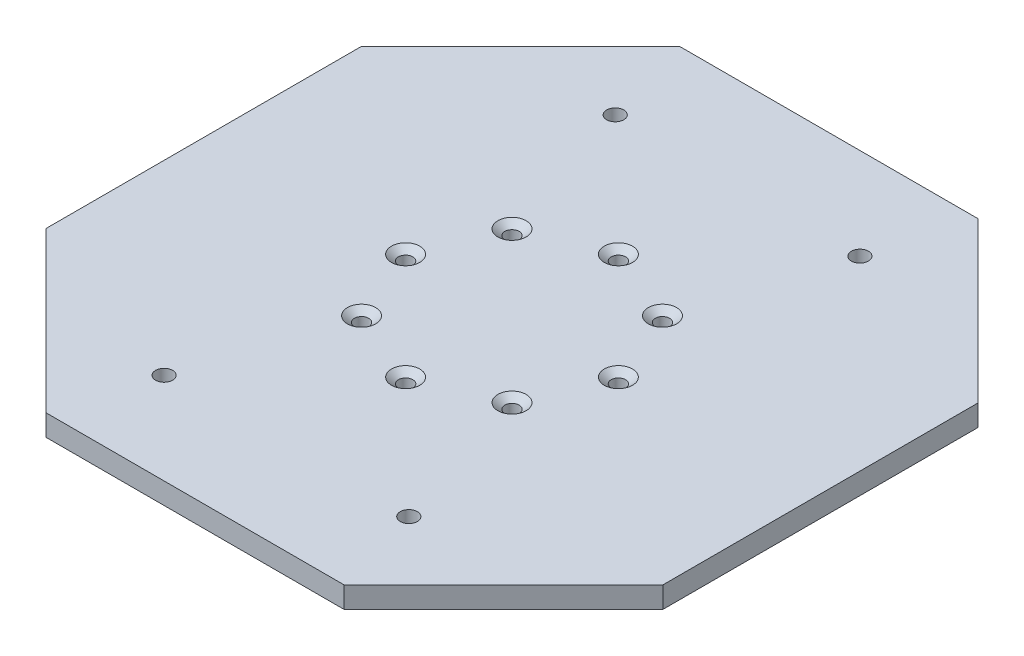
ISO-10303-21;
HEADER;
FILE_DESCRIPTION(('STEP AP214'),'2;1');
FILE_NAME('part.step','',(''),(''),'','','');
FILE_SCHEMA(('AUTOMOTIVE_DESIGN { 1 0 10303 214 1 1 1 1 }'));
ENDSEC;
DATA;
#1=APPLICATION_CONTEXT('core data for automotive mechanical design processes');
#2=APPLICATION_PROTOCOL_DEFINITION('international standard','automotive_design',2000,#1);
#3=PRODUCT_CONTEXT('',#1,'mechanical');
#4=PRODUCT('Part','Part','',(#3));
#5=PRODUCT_RELATED_PRODUCT_CATEGORY('part','',(#4));
#6=PRODUCT_DEFINITION_FORMATION('','',#4);
#7=PRODUCT_DEFINITION_CONTEXT('part definition',#1,'design');
#8=PRODUCT_DEFINITION('design','',#6,#7);
#9=PRODUCT_DEFINITION_SHAPE('','',#8);
#10=(LENGTH_UNIT() NAMED_UNIT(*) SI_UNIT(.MILLI.,.METRE.));
#11=(NAMED_UNIT(*) PLANE_ANGLE_UNIT() SI_UNIT($,.RADIAN.));
#12=(NAMED_UNIT(*) SI_UNIT($,.STERADIAN.) SOLID_ANGLE_UNIT());
#13=UNCERTAINTY_MEASURE_WITH_UNIT(LENGTH_MEASURE(1.E-05),#10,'distance_accuracy_value','');
#14=(GEOMETRIC_REPRESENTATION_CONTEXT(3) GLOBAL_UNCERTAINTY_ASSIGNED_CONTEXT((#13)) GLOBAL_UNIT_ASSIGNED_CONTEXT((#10,
#11,#12)) REPRESENTATION_CONTEXT('',''));
#15=CARTESIAN_POINT('',(0.,0.,0.));
#16=DIRECTION('',(0.,0.,1.));
#17=DIRECTION('',(1.,0.,0.));
#18=AXIS2_PLACEMENT_3D('',#15,#16,#17);
#19=CARTESIAN_POINT('',(-92.075,0.,-94.615));
#20=DIRECTION('',(0.,-1.,0.));
#21=DIRECTION('',(0.,0.,-1.));
#22=AXIS2_PLACEMENT_3D('',#19,#20,#21);
#23=PLANE('',#22);
#24=CARTESIAN_POINT('',(-22.4506403026726,0.,22.4506403026732));
#25=DIRECTION('',(0.,1.,0.));
#26=DIRECTION('',(0.,0.,1.));
#27=AXIS2_PLACEMENT_3D('',#24,#25,#26);
#28=CIRCLE('',#27,2.15264999999999);
#29=CARTESIAN_POINT('',(-22.4506403026726,0.,24.6032903026731));
#30=VERTEX_POINT('',#29);
#31=EDGE_CURVE('E264',#30,#30,#28,.T.);
#32=ORIENTED_EDGE('',*,*,#31,.T.);
#33=EDGE_LOOP('',(#32));
#34=FACE_BOUND('',#33,.T.);
#35=CARTESIAN_POINT('',(-31.75,0.,3.32563597524808E-13));
#36=DIRECTION('',(0.,1.,0.));
#37=DIRECTION('',(0.,0.,1.));
#38=AXIS2_PLACEMENT_3D('',#35,#36,#37);
#39=CIRCLE('',#38,2.15264999999999);
#40=CARTESIAN_POINT('',(-31.75,0.,2.15265000000032));
#41=VERTEX_POINT('',#40);
#42=EDGE_CURVE('E255',#41,#41,#39,.T.);
#43=ORIENTED_EDGE('',*,*,#42,.T.);
#44=EDGE_LOOP('',(#43));
#45=FACE_BOUND('',#44,.T.);
#46=CARTESIAN_POINT('',(-22.4506403026731,0.,-22.4506403026727));
#47=DIRECTION('',(0.,1.,0.));
#48=DIRECTION('',(0.,0.,1.));
#49=AXIS2_PLACEMENT_3D('',#46,#47,#48);
#50=CIRCLE('',#49,2.15264999999999);
#51=CARTESIAN_POINT('',(-22.4506403026731,0.,-20.2979903026727));
#52=VERTEX_POINT('',#51);
#53=EDGE_CURVE('E246',#52,#52,#50,.T.);
#54=ORIENTED_EDGE('',*,*,#53,.T.);
#55=EDGE_LOOP('',(#54));
#56=FACE_BOUND('',#55,.T.);
#57=CARTESIAN_POINT('',(0.,0.,-31.75));
#58=DIRECTION('',(0.,1.,0.));
#59=DIRECTION('',(0.,0.,1.));
#60=AXIS2_PLACEMENT_3D('',#57,#58,#59);
#61=CIRCLE('',#60,2.15264999999999);
#62=CARTESIAN_POINT('',(0.,0.,-29.59735));
#63=VERTEX_POINT('',#62);
#64=EDGE_CURVE('E237',#63,#63,#61,.T.);
#65=ORIENTED_EDGE('',*,*,#64,.T.);
#66=EDGE_LOOP('',(#65));
#67=FACE_BOUND('',#66,.T.);
#68=CARTESIAN_POINT('',(22.4506403026728,0.,-22.450640302673));
#69=DIRECTION('',(0.,1.,0.));
#70=DIRECTION('',(0.,0.,1.));
#71=AXIS2_PLACEMENT_3D('',#68,#69,#70);
#72=CIRCLE('',#71,2.15264999999999);
#73=CARTESIAN_POINT('',(22.4506403026728,0.,-20.297990302673));
#74=VERTEX_POINT('',#73);
#75=EDGE_CURVE('E228',#74,#74,#72,.T.);
#76=ORIENTED_EDGE('',*,*,#75,.T.);
#77=EDGE_LOOP('',(#76));
#78=FACE_BOUND('',#77,.T.);
#79=CARTESIAN_POINT('',(31.75,0.,-1.10854532508269E-13));
#80=DIRECTION('',(0.,1.,0.));
#81=DIRECTION('',(0.,0.,1.));
#82=AXIS2_PLACEMENT_3D('',#79,#80,#81);
#83=CIRCLE('',#82,2.15264999999999);
#84=CARTESIAN_POINT('',(31.75,0.,2.15264999999987));
#85=VERTEX_POINT('',#84);
#86=EDGE_CURVE('E219',#85,#85,#83,.T.);
#87=ORIENTED_EDGE('',*,*,#86,.T.);
#88=EDGE_LOOP('',(#87));
#89=FACE_BOUND('',#88,.T.);
#90=CARTESIAN_POINT('',(22.4506403026729,0.,22.4506403026728));
#91=DIRECTION('',(0.,1.,0.));
#92=DIRECTION('',(0.,0.,1.));
#93=AXIS2_PLACEMENT_3D('',#90,#91,#92);
#94=CIRCLE('',#93,2.15264999999999);
#95=CARTESIAN_POINT('',(22.4506403026729,0.,24.6032903026728));
#96=VERTEX_POINT('',#95);
#97=EDGE_CURVE('E210',#96,#96,#94,.T.);
#98=ORIENTED_EDGE('',*,*,#97,.T.);
#99=EDGE_LOOP('',(#98));
#100=FACE_BOUND('',#99,.T.);
#101=CARTESIAN_POINT('',(0.,0.,31.75));
#102=DIRECTION('',(0.,1.,0.));
#103=DIRECTION('',(0.,0.,1.));
#104=AXIS2_PLACEMENT_3D('',#101,#102,#103);
#105=CIRCLE('',#104,2.15264999999999);
#106=CARTESIAN_POINT('',(0.,0.,33.90265));
#107=VERTEX_POINT('',#106);
#108=EDGE_CURVE('E201',#107,#107,#105,.T.);
#109=ORIENTED_EDGE('',*,*,#108,.T.);
#110=EDGE_LOOP('',(#109));
#111=FACE_BOUND('',#110,.T.);
#112=CARTESIAN_POINT('',(36.5125,0.,67.31));
#113=DIRECTION('',(0.,1.,0.));
#114=DIRECTION('',(0.,0.,1.));
#115=AXIS2_PLACEMENT_3D('',#112,#113,#114);
#116=CIRCLE('',#115,2.5527);
#117=CARTESIAN_POINT('',(36.5125,0.,69.8627));
#118=VERTEX_POINT('',#117);
#119=EDGE_CURVE('E195',#118,#118,#116,.T.);
#120=ORIENTED_EDGE('',*,*,#119,.T.);
#121=EDGE_LOOP('',(#120));
#122=FACE_BOUND('',#121,.T.);
#123=DIRECTION('',(0.,0.,1.));
#124=VECTOR('',#123,1.);
#125=CARTESIAN_POINT('',(-92.075,0.,46.99));
#126=LINE('',#125,#124);
#127=CARTESIAN_POINT('',(-92.075,0.,-46.99));
#128=VERTEX_POINT('',#127);
#129=CARTESIAN_POINT('',(-92.075,0.,46.99));
#130=VERTEX_POINT('',#129);
#131=EDGE_CURVE('E130',#128,#130,#126,.T.);
#132=ORIENTED_EDGE('',*,*,#131,.F.);
#133=DIRECTION('',(-0.707106781186548,0.,0.707106781186547));
#134=VECTOR('',#133,1.);
#135=CARTESIAN_POINT('',(-92.075,0.,-46.99));
#136=LINE('',#135,#134);
#137=CARTESIAN_POINT('',(-44.45,0.,-94.615));
#138=VERTEX_POINT('',#137);
#139=EDGE_CURVE('E85',#138,#128,#136,.T.);
#140=ORIENTED_EDGE('',*,*,#139,.F.);
#141=DIRECTION('',(-1.,0.,0.));
#142=VECTOR('',#141,1.);
#143=CARTESIAN_POINT('',(-44.45,0.,-94.615));
#144=LINE('',#143,#142);
#145=CARTESIAN_POINT('',(44.45,0.,-94.615));
#146=VERTEX_POINT('',#145);
#147=EDGE_CURVE('E79',#146,#138,#144,.T.);
#148=ORIENTED_EDGE('',*,*,#147,.F.);
#149=DIRECTION('',(-0.707106781186547,0.,-0.707106781186548));
#150=VECTOR('',#149,1.);
#151=CARTESIAN_POINT('',(44.45,0.,-94.615));
#152=LINE('',#151,#150);
#153=CARTESIAN_POINT('',(92.075,0.,-46.99));
#154=VERTEX_POINT('',#153);
#155=EDGE_CURVE('E120',#154,#146,#152,.T.);
#156=ORIENTED_EDGE('',*,*,#155,.F.);
#157=DIRECTION('',(0.,0.,-1.));
#158=VECTOR('',#157,1.);
#159=CARTESIAN_POINT('',(92.075,0.,46.99));
#160=LINE('',#159,#158);
#161=CARTESIAN_POINT('',(92.075,0.,46.99));
#162=VERTEX_POINT('',#161);
#163=EDGE_CURVE('E140',#162,#154,#160,.T.);
#164=ORIENTED_EDGE('',*,*,#163,.F.);
#165=DIRECTION('',(0.707106781186547,0.,-0.707106781186547));
#166=VECTOR('',#165,1.);
#167=CARTESIAN_POINT('',(92.075,0.,46.99));
#168=LINE('',#167,#166);
#169=CARTESIAN_POINT('',(44.45,0.,94.615));
#170=VERTEX_POINT('',#169);
#171=EDGE_CURVE('E138',#170,#162,#168,.T.);
#172=ORIENTED_EDGE('',*,*,#171,.F.);
#173=DIRECTION('',(1.,0.,0.));
#174=VECTOR('',#173,1.);
#175=CARTESIAN_POINT('',(-44.45,0.,94.615));
#176=LINE('',#175,#174);
#177=CARTESIAN_POINT('',(-44.45,0.,94.615));
#178=VERTEX_POINT('',#177);
#179=EDGE_CURVE('E136',#178,#170,#176,.T.);
#180=ORIENTED_EDGE('',*,*,#179,.F.);
#181=DIRECTION('',(0.707106781186547,0.,0.707106781186548));
#182=VECTOR('',#181,1.);
#183=CARTESIAN_POINT('',(-92.075,0.,46.99));
#184=LINE('',#183,#182);
#185=EDGE_CURVE('E133',#130,#178,#184,.T.);
#186=ORIENTED_EDGE('',*,*,#185,.F.);
#187=EDGE_LOOP('',(#132,#140,#148,#156,#164,#172,#180,#186));
#188=FACE_BOUND('',#187,.T.);
#189=CARTESIAN_POINT('',(36.5125,0.,-67.31));
#190=DIRECTION('',(0.,1.,0.));
#191=DIRECTION('',(0.,0.,1.));
#192=AXIS2_PLACEMENT_3D('',#189,#190,#191);
#193=CIRCLE('',#192,2.5527);
#194=CARTESIAN_POINT('',(36.5125,0.,-64.7573));
#195=VERTEX_POINT('',#194);
#196=EDGE_CURVE('E134',#195,#195,#193,.T.);
#197=ORIENTED_EDGE('',*,*,#196,.T.);
#198=EDGE_LOOP('',(#197));
#199=FACE_BOUND('',#198,.T.);
#200=CARTESIAN_POINT('',(-36.5125,0.,-67.31));
#201=DIRECTION('',(0.,1.,0.));
#202=DIRECTION('',(0.,0.,1.));
#203=AXIS2_PLACEMENT_3D('',#200,#201,#202);
#204=CIRCLE('',#203,2.5527);
#205=CARTESIAN_POINT('',(-36.5125,0.,-64.7573));
#206=VERTEX_POINT('',#205);
#207=EDGE_CURVE('E183',#206,#206,#204,.T.);
#208=ORIENTED_EDGE('',*,*,#207,.T.);
#209=EDGE_LOOP('',(#208));
#210=FACE_BOUND('',#209,.T.);
#211=CARTESIAN_POINT('',(-36.5125,0.,67.31));
#212=DIRECTION('',(0.,1.,0.));
#213=DIRECTION('',(0.,0.,1.));
#214=AXIS2_PLACEMENT_3D('',#211,#212,#213);
#215=CIRCLE('',#214,2.5527);
#216=CARTESIAN_POINT('',(-36.5125,0.,69.8627));
#217=VERTEX_POINT('',#216);
#218=EDGE_CURVE('E189',#217,#217,#215,.T.);
#219=ORIENTED_EDGE('',*,*,#218,.T.);
#220=EDGE_LOOP('',(#219));
#221=FACE_BOUND('',#220,.T.);
#222=ADVANCED_FACE('F33',(#34,#45,#56,#67,#78,#89,#100,#111,#122,#188,#199,#210,#221),#23,.T.);
#223=CARTESIAN_POINT('',(-92.075,6.35,46.99));
#224=DIRECTION('',(1.,0.,0.));
#225=DIRECTION('',(0.,0.,-1.));
#226=AXIS2_PLACEMENT_3D('',#223,#224,#225);
#227=PLANE('',#226);
#228=ORIENTED_EDGE('',*,*,#131,.T.);
#229=DIRECTION('',(0.,-1.,0.));
#230=VECTOR('',#229,1.);
#231=CARTESIAN_POINT('',(-92.075,6.35,46.99));
#232=LINE('',#231,#230);
#233=CARTESIAN_POINT('',(-92.075,6.35,46.99));
#234=VERTEX_POINT('',#233);
#235=EDGE_CURVE('E11',#234,#130,#232,.T.);
#236=ORIENTED_EDGE('',*,*,#235,.F.);
#237=DIRECTION('',(0.,0.,1.));
#238=VECTOR('',#237,1.);
#239=CARTESIAN_POINT('',(-92.075,6.35,46.99));
#240=LINE('',#239,#238);
#241=CARTESIAN_POINT('',(-92.075,6.35,-46.99));
#242=VERTEX_POINT('',#241);
#243=EDGE_CURVE('E145',#242,#234,#240,.T.);
#244=ORIENTED_EDGE('',*,*,#243,.F.);
#245=DIRECTION('',(0.,-1.,0.));
#246=VECTOR('',#245,1.);
#247=CARTESIAN_POINT('',(-92.075,6.35,-46.99));
#248=LINE('',#247,#246);
#249=EDGE_CURVE('E126',#242,#128,#248,.T.);
#250=ORIENTED_EDGE('',*,*,#249,.T.);
#251=EDGE_LOOP('',(#228,#236,#244,#250));
#252=FACE_BOUND('',#251,.T.);
#253=ADVANCED_FACE('F35',(#252),#227,.F.);
#254=CARTESIAN_POINT('',(-92.075,6.35,46.99));
#255=DIRECTION('',(0.707106781186548,0.,-0.707106781186547));
#256=DIRECTION('',(-0.707106781186547,0.,-0.707106781186548));
#257=AXIS2_PLACEMENT_3D('',#254,#255,#256);
#258=PLANE('',#257);
#259=ORIENTED_EDGE('',*,*,#185,.T.);
#260=DIRECTION('',(0.,-1.,0.));
#261=VECTOR('',#260,1.);
#262=CARTESIAN_POINT('',(-44.45,6.35,94.615));
#263=LINE('',#262,#261);
#264=CARTESIAN_POINT('',(-44.45,6.35,94.615));
#265=VERTEX_POINT('',#264);
#266=EDGE_CURVE('E42',#265,#178,#263,.T.);
#267=ORIENTED_EDGE('',*,*,#266,.F.);
#268=DIRECTION('',(0.707106781186547,0.,0.707106781186548));
#269=VECTOR('',#268,1.);
#270=CARTESIAN_POINT('',(-92.075,6.35,46.99));
#271=LINE('',#270,#269);
#272=EDGE_CURVE('E93',#234,#265,#271,.T.);
#273=ORIENTED_EDGE('',*,*,#272,.F.);
#274=ORIENTED_EDGE('',*,*,#235,.T.);
#275=EDGE_LOOP('',(#259,#267,#273,#274));
#276=FACE_BOUND('',#275,.T.);
#277=ADVANCED_FACE('F320',(#276),#258,.F.);
#278=CARTESIAN_POINT('',(-44.45,6.35,94.615));
#279=DIRECTION('',(0.,0.,-1.));
#280=DIRECTION('',(-1.,0.,0.));
#281=AXIS2_PLACEMENT_3D('',#278,#279,#280);
#282=PLANE('',#281);
#283=ORIENTED_EDGE('',*,*,#179,.T.);
#284=DIRECTION('',(0.,-1.,0.));
#285=VECTOR('',#284,1.);
#286=CARTESIAN_POINT('',(44.45,6.35,94.615));
#287=LINE('',#286,#285);
#288=CARTESIAN_POINT('',(44.45,6.35,94.615));
#289=VERTEX_POINT('',#288);
#290=EDGE_CURVE('E152',#289,#170,#287,.T.);
#291=ORIENTED_EDGE('',*,*,#290,.F.);
#292=DIRECTION('',(1.,0.,0.));
#293=VECTOR('',#292,1.);
#294=CARTESIAN_POINT('',(-44.45,6.35,94.615));
#295=LINE('',#294,#293);
#296=EDGE_CURVE('E160',#265,#289,#295,.T.);
#297=ORIENTED_EDGE('',*,*,#296,.F.);
#298=ORIENTED_EDGE('',*,*,#266,.T.);
#299=EDGE_LOOP('',(#283,#291,#297,#298));
#300=FACE_BOUND('',#299,.T.);
#301=ADVANCED_FACE('F158',(#300),#282,.F.);
#302=CARTESIAN_POINT('',(92.075,6.35,46.99));
#303=DIRECTION('',(-0.707106781186548,0.,-0.707106781186548));
#304=DIRECTION('',(-0.707106781186548,0.,0.707106781186548));
#305=AXIS2_PLACEMENT_3D('',#302,#303,#304);
#306=PLANE('',#305);
#307=ORIENTED_EDGE('',*,*,#171,.T.);
#308=DIRECTION('',(0.,-1.,0.));
#309=VECTOR('',#308,1.);
#310=CARTESIAN_POINT('',(92.075,6.35,46.99));
#311=LINE('',#310,#309);
#312=CARTESIAN_POINT('',(92.075,6.35,46.99));
#313=VERTEX_POINT('',#312);
#314=EDGE_CURVE('E149',#313,#162,#311,.T.);
#315=ORIENTED_EDGE('',*,*,#314,.F.);
#316=DIRECTION('',(0.707106781186547,0.,-0.707106781186547));
#317=VECTOR('',#316,1.);
#318=CARTESIAN_POINT('',(92.075,6.35,46.99));
#319=LINE('',#318,#317);
#320=EDGE_CURVE('E172',#289,#313,#319,.T.);
#321=ORIENTED_EDGE('',*,*,#320,.F.);
#322=ORIENTED_EDGE('',*,*,#290,.T.);
#323=EDGE_LOOP('',(#307,#315,#321,#322));
#324=FACE_BOUND('',#323,.T.);
#325=ADVANCED_FACE('F168',(#324),#306,.F.);
#326=CARTESIAN_POINT('',(92.075,6.35,46.99));
#327=DIRECTION('',(-1.,0.,0.));
#328=DIRECTION('',(0.,0.,1.));
#329=AXIS2_PLACEMENT_3D('',#326,#327,#328);
#330=PLANE('',#329);
#331=ORIENTED_EDGE('',*,*,#163,.T.);
#332=DIRECTION('',(0.,-1.,0.));
#333=VECTOR('',#332,1.);
#334=CARTESIAN_POINT('',(92.075,6.35,-46.99));
#335=LINE('',#334,#333);
#336=CARTESIAN_POINT('',(92.075,6.35,-46.99));
#337=VERTEX_POINT('',#336);
#338=EDGE_CURVE('E121',#337,#154,#335,.T.);
#339=ORIENTED_EDGE('',*,*,#338,.F.);
#340=DIRECTION('',(0.,0.,-1.));
#341=VECTOR('',#340,1.);
#342=CARTESIAN_POINT('',(92.075,6.35,46.99));
#343=LINE('',#342,#341);
#344=EDGE_CURVE('E112',#313,#337,#343,.T.);
#345=ORIENTED_EDGE('',*,*,#344,.F.);
#346=ORIENTED_EDGE('',*,*,#314,.T.);
#347=EDGE_LOOP('',(#331,#339,#345,#346));
#348=FACE_BOUND('',#347,.T.);
#349=ADVANCED_FACE('F171',(#348),#330,.F.);
#350=CARTESIAN_POINT('',(44.45,6.35,-94.615));
#351=DIRECTION('',(-0.707106781186548,0.,0.707106781186547));
#352=DIRECTION('',(0.707106781186547,0.,0.707106781186548));
#353=AXIS2_PLACEMENT_3D('',#350,#351,#352);
#354=PLANE('',#353);
#355=ORIENTED_EDGE('',*,*,#155,.T.);
#356=DIRECTION('',(0.,-1.,0.));
#357=VECTOR('',#356,1.);
#358=CARTESIAN_POINT('',(44.45,6.35,-94.615));
#359=LINE('',#358,#357);
#360=CARTESIAN_POINT('',(44.45,6.35,-94.615));
#361=VERTEX_POINT('',#360);
#362=EDGE_CURVE('E117',#361,#146,#359,.T.);
#363=ORIENTED_EDGE('',*,*,#362,.F.);
#364=DIRECTION('',(-0.707106781186547,0.,-0.707106781186548));
#365=VECTOR('',#364,1.);
#366=CARTESIAN_POINT('',(44.45,6.35,-94.615));
#367=LINE('',#366,#365);
#368=EDGE_CURVE('E106',#337,#361,#367,.T.);
#369=ORIENTED_EDGE('',*,*,#368,.F.);
#370=ORIENTED_EDGE('',*,*,#338,.T.);
#371=EDGE_LOOP('',(#355,#363,#369,#370));
#372=FACE_BOUND('',#371,.T.);
#373=ADVANCED_FACE('F118',(#372),#354,.F.);
#374=CARTESIAN_POINT('',(-44.45,6.35,-94.615));
#375=DIRECTION('',(0.,0.,1.));
#376=DIRECTION('',(1.,0.,0.));
#377=AXIS2_PLACEMENT_3D('',#374,#375,#376);
#378=PLANE('',#377);
#379=ORIENTED_EDGE('',*,*,#147,.T.);
#380=DIRECTION('',(0.,-1.,0.));
#381=VECTOR('',#380,1.);
#382=CARTESIAN_POINT('',(-44.45,6.35,-94.615));
#383=LINE('',#382,#381);
#384=CARTESIAN_POINT('',(-44.45,6.35,-94.615));
#385=VERTEX_POINT('',#384);
#386=EDGE_CURVE('E122',#385,#138,#383,.T.);
#387=ORIENTED_EDGE('',*,*,#386,.F.);
#388=DIRECTION('',(-1.,0.,0.));
#389=VECTOR('',#388,1.);
#390=CARTESIAN_POINT('',(-44.45,6.35,-94.615));
#391=LINE('',#390,#389);
#392=EDGE_CURVE('E110',#361,#385,#391,.T.);
#393=ORIENTED_EDGE('',*,*,#392,.F.);
#394=ORIENTED_EDGE('',*,*,#362,.T.);
#395=EDGE_LOOP('',(#379,#387,#393,#394));
#396=FACE_BOUND('',#395,.T.);
#397=ADVANCED_FACE('F124',(#396),#378,.F.);
#398=CARTESIAN_POINT('',(-92.075,6.35,-46.99));
#399=DIRECTION('',(0.707106781186547,0.,0.707106781186548));
#400=DIRECTION('',(0.707106781186548,0.,-0.707106781186547));
#401=AXIS2_PLACEMENT_3D('',#398,#399,#400);
#402=PLANE('',#401);
#403=ORIENTED_EDGE('',*,*,#139,.T.);
#404=ORIENTED_EDGE('',*,*,#249,.F.);
#405=DIRECTION('',(-0.707106781186548,0.,0.707106781186547));
#406=VECTOR('',#405,1.);
#407=CARTESIAN_POINT('',(-92.075,6.35,-46.99));
#408=LINE('',#407,#406);
#409=EDGE_CURVE('E50',#385,#242,#408,.T.);
#410=ORIENTED_EDGE('',*,*,#409,.F.);
#411=ORIENTED_EDGE('',*,*,#386,.T.);
#412=EDGE_LOOP('',(#403,#404,#410,#411));
#413=FACE_BOUND('',#412,.T.);
#414=ADVANCED_FACE('F279',(#413),#402,.F.);
#415=CARTESIAN_POINT('',(-92.075,6.35,-94.615));
#416=DIRECTION('',(0.,-1.,0.));
#417=DIRECTION('',(0.,0.,-1.));
#418=AXIS2_PLACEMENT_3D('',#415,#416,#417);
#419=PLANE('',#418);
#420=CARTESIAN_POINT('',(-22.4506403026726,6.35,22.4506403026732));
#421=DIRECTION('',(0.,1.,0.));
#422=DIRECTION('',(0.,0.,1.));
#423=AXIS2_PLACEMENT_3D('',#420,#421,#422);
#424=CIRCLE('',#423,4.2164);
#425=CARTESIAN_POINT('',(-22.4506403026726,6.35,26.6670403026732));
#426=VERTEX_POINT('',#425);
#427=EDGE_CURVE('E270',#426,#426,#424,.T.);
#428=ORIENTED_EDGE('',*,*,#427,.F.);
#429=EDGE_LOOP('',(#428));
#430=FACE_BOUND('',#429,.T.);
#431=CARTESIAN_POINT('',(-31.75,6.35,3.32563597524808E-13));
#432=DIRECTION('',(0.,1.,0.));
#433=DIRECTION('',(0.,0.,1.));
#434=AXIS2_PLACEMENT_3D('',#431,#432,#433);
#435=CIRCLE('',#434,4.2164);
#436=CARTESIAN_POINT('',(-31.75,6.35,4.21640000000033));
#437=VERTEX_POINT('',#436);
#438=EDGE_CURVE('E261',#437,#437,#435,.T.);
#439=ORIENTED_EDGE('',*,*,#438,.F.);
#440=EDGE_LOOP('',(#439));
#441=FACE_BOUND('',#440,.T.);
#442=CARTESIAN_POINT('',(-22.4506403026731,6.35,-22.4506403026727));
#443=DIRECTION('',(0.,1.,0.));
#444=DIRECTION('',(0.,0.,1.));
#445=AXIS2_PLACEMENT_3D('',#442,#443,#444);
#446=CIRCLE('',#445,4.2164);
#447=CARTESIAN_POINT('',(-22.4506403026731,6.35,-18.2342403026727));
#448=VERTEX_POINT('',#447);
#449=EDGE_CURVE('E252',#448,#448,#446,.T.);
#450=ORIENTED_EDGE('',*,*,#449,.F.);
#451=EDGE_LOOP('',(#450));
#452=FACE_BOUND('',#451,.T.);
#453=CARTESIAN_POINT('',(0.,6.35,-31.75));
#454=DIRECTION('',(0.,1.,0.));
#455=DIRECTION('',(0.,0.,1.));
#456=AXIS2_PLACEMENT_3D('',#453,#454,#455);
#457=CIRCLE('',#456,4.2164);
#458=CARTESIAN_POINT('',(0.,6.35,-27.5336));
#459=VERTEX_POINT('',#458);
#460=EDGE_CURVE('E243',#459,#459,#457,.T.);
#461=ORIENTED_EDGE('',*,*,#460,.F.);
#462=EDGE_LOOP('',(#461));
#463=FACE_BOUND('',#462,.T.);
#464=CARTESIAN_POINT('',(22.4506403026728,6.35,-22.450640302673));
#465=DIRECTION('',(0.,1.,0.));
#466=DIRECTION('',(0.,0.,1.));
#467=AXIS2_PLACEMENT_3D('',#464,#465,#466);
#468=CIRCLE('',#467,4.2164);
#469=CARTESIAN_POINT('',(22.4506403026728,6.35,-18.234240302673));
#470=VERTEX_POINT('',#469);
#471=EDGE_CURVE('E234',#470,#470,#468,.T.);
#472=ORIENTED_EDGE('',*,*,#471,.F.);
#473=EDGE_LOOP('',(#472));
#474=FACE_BOUND('',#473,.T.);
#475=CARTESIAN_POINT('',(31.75,6.35,-1.10854532508269E-13));
#476=DIRECTION('',(0.,1.,0.));
#477=DIRECTION('',(0.,0.,1.));
#478=AXIS2_PLACEMENT_3D('',#475,#476,#477);
#479=CIRCLE('',#478,4.2164);
#480=CARTESIAN_POINT('',(31.75,6.35,4.21639999999989));
#481=VERTEX_POINT('',#480);
#482=EDGE_CURVE('E225',#481,#481,#479,.T.);
#483=ORIENTED_EDGE('',*,*,#482,.F.);
#484=EDGE_LOOP('',(#483));
#485=FACE_BOUND('',#484,.T.);
#486=CARTESIAN_POINT('',(22.4506403026729,6.35,22.4506403026728));
#487=DIRECTION('',(0.,1.,0.));
#488=DIRECTION('',(0.,0.,1.));
#489=AXIS2_PLACEMENT_3D('',#486,#487,#488);
#490=CIRCLE('',#489,4.2164);
#491=CARTESIAN_POINT('',(22.4506403026729,6.35,26.6670403026728));
#492=VERTEX_POINT('',#491);
#493=EDGE_CURVE('E216',#492,#492,#490,.T.);
#494=ORIENTED_EDGE('',*,*,#493,.F.);
#495=EDGE_LOOP('',(#494));
#496=FACE_BOUND('',#495,.T.);
#497=CARTESIAN_POINT('',(0.,6.35,31.75));
#498=DIRECTION('',(0.,1.,0.));
#499=DIRECTION('',(0.,0.,1.));
#500=AXIS2_PLACEMENT_3D('',#497,#498,#499);
#501=CIRCLE('',#500,4.2164);
#502=CARTESIAN_POINT('',(0.,6.35,35.9664));
#503=VERTEX_POINT('',#502);
#504=EDGE_CURVE('E207',#503,#503,#501,.T.);
#505=ORIENTED_EDGE('',*,*,#504,.F.);
#506=EDGE_LOOP('',(#505));
#507=FACE_BOUND('',#506,.T.);
#508=CARTESIAN_POINT('',(36.5125,6.35,67.31));
#509=DIRECTION('',(0.,1.,0.));
#510=DIRECTION('',(0.,0.,1.));
#511=AXIS2_PLACEMENT_3D('',#508,#509,#510);
#512=CIRCLE('',#511,2.55269999999998);
#513=CARTESIAN_POINT('',(36.5125,6.35,69.8627));
#514=VERTEX_POINT('',#513);
#515=EDGE_CURVE('E198',#514,#514,#512,.T.);
#516=ORIENTED_EDGE('',*,*,#515,.F.);
#517=EDGE_LOOP('',(#516));
#518=FACE_BOUND('',#517,.T.);
#519=CARTESIAN_POINT('',(-36.5125,6.35,67.31));
#520=DIRECTION('',(0.,1.,0.));
#521=DIRECTION('',(0.,0.,1.));
#522=AXIS2_PLACEMENT_3D('',#519,#520,#521);
#523=CIRCLE('',#522,2.55269999999998);
#524=CARTESIAN_POINT('',(-36.5125,6.35,69.8627));
#525=VERTEX_POINT('',#524);
#526=EDGE_CURVE('E192',#525,#525,#523,.T.);
#527=ORIENTED_EDGE('',*,*,#526,.F.);
#528=EDGE_LOOP('',(#527));
#529=FACE_BOUND('',#528,.T.);
#530=CARTESIAN_POINT('',(-36.5125,6.35,-67.31));
#531=DIRECTION('',(0.,1.,0.));
#532=DIRECTION('',(0.,0.,1.));
#533=AXIS2_PLACEMENT_3D('',#530,#531,#532);
#534=CIRCLE('',#533,2.55269999999998);
#535=CARTESIAN_POINT('',(-36.5125,6.35,-64.7573));
#536=VERTEX_POINT('',#535);
#537=EDGE_CURVE('E186',#536,#536,#534,.T.);
#538=ORIENTED_EDGE('',*,*,#537,.F.);
#539=EDGE_LOOP('',(#538));
#540=FACE_BOUND('',#539,.T.);
#541=CARTESIAN_POINT('',(36.5125,6.35,-67.31));
#542=DIRECTION('',(0.,1.,0.));
#543=DIRECTION('',(0.,0.,1.));
#544=AXIS2_PLACEMENT_3D('',#541,#542,#543);
#545=CIRCLE('',#544,2.55269999999998);
#546=CARTESIAN_POINT('',(36.5125,6.35,-64.7573));
#547=VERTEX_POINT('',#546);
#548=EDGE_CURVE('E180',#547,#547,#545,.T.);
#549=ORIENTED_EDGE('',*,*,#548,.F.);
#550=EDGE_LOOP('',(#549));
#551=FACE_BOUND('',#550,.T.);
#552=ORIENTED_EDGE('',*,*,#243,.T.);
#553=ORIENTED_EDGE('',*,*,#272,.T.);
#554=ORIENTED_EDGE('',*,*,#296,.T.);
#555=ORIENTED_EDGE('',*,*,#320,.T.);
#556=ORIENTED_EDGE('',*,*,#344,.T.);
#557=ORIENTED_EDGE('',*,*,#368,.T.);
#558=ORIENTED_EDGE('',*,*,#392,.T.);
#559=ORIENTED_EDGE('',*,*,#409,.T.);
#560=EDGE_LOOP('',(#552,#553,#554,#555,#556,#557,#558,#559));
#561=FACE_BOUND('',#560,.T.);
#562=ADVANCED_FACE('F108',(#430,#441,#452,#463,#474,#485,#496,#507,#518,#529,#540,#551,#561),
#419,.F.);
#563=CARTESIAN_POINT('',(36.5125,6.35,-67.31));
#564=DIRECTION('',(0.,1.,0.));
#565=DIRECTION('',(0.,0.,1.));
#566=AXIS2_PLACEMENT_3D('',#563,#564,#565);
#567=CYLINDRICAL_SURFACE('',#566,2.55269999999999);
#568=ORIENTED_EDGE('',*,*,#196,.F.);
#569=EDGE_LOOP('',(#568));
#570=FACE_BOUND('',#569,.T.);
#571=ORIENTED_EDGE('',*,*,#548,.T.);
#572=EDGE_LOOP('',(#571));
#573=FACE_BOUND('',#572,.T.);
#574=ADVANCED_FACE('F278',(#570,#573),#567,.F.);
#575=CARTESIAN_POINT('',(-36.5125,6.35,-67.31));
#576=DIRECTION('',(0.,1.,0.));
#577=DIRECTION('',(0.,0.,1.));
#578=AXIS2_PLACEMENT_3D('',#575,#576,#577);
#579=CYLINDRICAL_SURFACE('',#578,2.55269999999999);
#580=ORIENTED_EDGE('',*,*,#207,.F.);
#581=EDGE_LOOP('',(#580));
#582=FACE_BOUND('',#581,.T.);
#583=ORIENTED_EDGE('',*,*,#537,.T.);
#584=EDGE_LOOP('',(#583));
#585=FACE_BOUND('',#584,.T.);
#586=ADVANCED_FACE('F304',(#582,#585),#579,.F.);
#587=CARTESIAN_POINT('',(-36.5125,6.35,67.31));
#588=DIRECTION('',(0.,1.,0.));
#589=DIRECTION('',(0.,0.,1.));
#590=AXIS2_PLACEMENT_3D('',#587,#588,#589);
#591=CYLINDRICAL_SURFACE('',#590,2.55269999999999);
#592=ORIENTED_EDGE('',*,*,#218,.F.);
#593=EDGE_LOOP('',(#592));
#594=FACE_BOUND('',#593,.T.);
#595=ORIENTED_EDGE('',*,*,#526,.T.);
#596=EDGE_LOOP('',(#595));
#597=FACE_BOUND('',#596,.T.);
#598=ADVANCED_FACE('F310',(#594,#597),#591,.F.);
#599=CARTESIAN_POINT('',(36.5125,6.35,67.31));
#600=DIRECTION('',(0.,1.,0.));
#601=DIRECTION('',(0.,0.,1.));
#602=AXIS2_PLACEMENT_3D('',#599,#600,#601);
#603=CYLINDRICAL_SURFACE('',#602,2.55269999999999);
#604=ORIENTED_EDGE('',*,*,#119,.F.);
#605=EDGE_LOOP('',(#604));
#606=FACE_BOUND('',#605,.T.);
#607=ORIENTED_EDGE('',*,*,#515,.T.);
#608=EDGE_LOOP('',(#607));
#609=FACE_BOUND('',#608,.T.);
#610=ADVANCED_FACE('F527',(#606,#609),#603,.F.);
#611=CARTESIAN_POINT('',(0.,6.35,31.75));
#612=DIRECTION('',(0.,1.,0.));
#613=DIRECTION('',(0.,0.,1.));
#614=AXIS2_PLACEMENT_3D('',#611,#612,#613);
#615=CYLINDRICAL_SURFACE('',#614,2.15264999999999);
#616=ORIENTED_EDGE('',*,*,#108,.F.);
#617=EDGE_LOOP('',(#616));
#618=FACE_BOUND('',#617,.T.);
#619=CARTESIAN_POINT('',(0.,4.61830813615789,31.75));
#620=DIRECTION('',(0.,1.,0.));
#621=DIRECTION('',(0.,0.,1.));
#622=AXIS2_PLACEMENT_3D('',#619,#620,#621);
#623=CIRCLE('',#622,2.15265);
#624=CARTESIAN_POINT('',(0.,4.61830813615789,33.90265));
#625=VERTEX_POINT('',#624);
#626=EDGE_CURVE('E204',#625,#625,#623,.T.);
#627=ORIENTED_EDGE('',*,*,#626,.T.);
#628=EDGE_LOOP('',(#627));
#629=FACE_BOUND('',#628,.T.);
#630=ADVANCED_FACE('F523',(#618,#629),#615,.F.);
#631=CARTESIAN_POINT('',(0.,6.35,31.75));
#632=DIRECTION('',(0.,1.,0.));
#633=DIRECTION('',(0.,0.,1.));
#634=AXIS2_PLACEMENT_3D('',#631,#632,#633);
#635=CONICAL_SURFACE('',#634,4.2164,0.872664625997164);
#636=ORIENTED_EDGE('',*,*,#626,.F.);
#637=EDGE_LOOP('',(#636));
#638=FACE_BOUND('',#637,.T.);
#639=ORIENTED_EDGE('',*,*,#504,.T.);
#640=EDGE_LOOP('',(#639));
#641=FACE_BOUND('',#640,.T.);
#642=ADVANCED_FACE('F385',(#638,#641),#635,.F.);
#643=CARTESIAN_POINT('',(22.4506403026729,6.35,22.4506403026728));
#644=DIRECTION('',(0.,1.,0.));
#645=DIRECTION('',(0.,0.,1.));
#646=AXIS2_PLACEMENT_3D('',#643,#644,#645);
#647=CYLINDRICAL_SURFACE('',#646,2.15264999999999);
#648=ORIENTED_EDGE('',*,*,#97,.F.);
#649=EDGE_LOOP('',(#648));
#650=FACE_BOUND('',#649,.T.);
#651=CARTESIAN_POINT('',(22.4506403026729,4.61830813615789,22.4506403026728));
#652=DIRECTION('',(0.,1.,0.));
#653=DIRECTION('',(0.,0.,1.));
#654=AXIS2_PLACEMENT_3D('',#651,#652,#653);
#655=CIRCLE('',#654,2.15265);
#656=CARTESIAN_POINT('',(22.4506403026729,4.61830813615789,24.6032903026728));
#657=VERTEX_POINT('',#656);
#658=EDGE_CURVE('E213',#657,#657,#655,.T.);
#659=ORIENTED_EDGE('',*,*,#658,.T.);
#660=EDGE_LOOP('',(#659));
#661=FACE_BOUND('',#660,.T.);
#662=ADVANCED_FACE('F379',(#650,#661),#647,.F.);
#663=CARTESIAN_POINT('',(22.4506403026729,6.35,22.4506403026728));
#664=DIRECTION('',(0.,1.,0.));
#665=DIRECTION('',(0.,0.,1.));
#666=AXIS2_PLACEMENT_3D('',#663,#664,#665);
#667=CONICAL_SURFACE('',#666,4.2164,0.872664625997164);
#668=ORIENTED_EDGE('',*,*,#658,.F.);
#669=EDGE_LOOP('',(#668));
#670=FACE_BOUND('',#669,.T.);
#671=ORIENTED_EDGE('',*,*,#493,.T.);
#672=EDGE_LOOP('',(#671));
#673=FACE_BOUND('',#672,.T.);
#674=ADVANCED_FACE('F384',(#670,#673),#667,.F.);
#675=CARTESIAN_POINT('',(31.75,6.35,-1.10854532508269E-13));
#676=DIRECTION('',(0.,1.,0.));
#677=DIRECTION('',(0.,0.,1.));
#678=AXIS2_PLACEMENT_3D('',#675,#676,#677);
#679=CYLINDRICAL_SURFACE('',#678,2.15264999999999);
#680=ORIENTED_EDGE('',*,*,#86,.F.);
#681=EDGE_LOOP('',(#680));
#682=FACE_BOUND('',#681,.T.);
#683=CARTESIAN_POINT('',(31.75,4.61830813615789,-1.10854532508269E-13));
#684=DIRECTION('',(0.,1.,0.));
#685=DIRECTION('',(0.,0.,1.));
#686=AXIS2_PLACEMENT_3D('',#683,#684,#685);
#687=CIRCLE('',#686,2.15265);
#688=CARTESIAN_POINT('',(31.75,4.61830813615789,2.15264999999989));
#689=VERTEX_POINT('',#688);
#690=EDGE_CURVE('E222',#689,#689,#687,.T.);
#691=ORIENTED_EDGE('',*,*,#690,.T.);
#692=EDGE_LOOP('',(#691));
#693=FACE_BOUND('',#692,.T.);
#694=ADVANCED_FACE('F397',(#682,#693),#679,.F.);
#695=CARTESIAN_POINT('',(31.75,6.35,-1.10854532508269E-13));
#696=DIRECTION('',(0.,1.,0.));
#697=DIRECTION('',(0.,0.,1.));
#698=AXIS2_PLACEMENT_3D('',#695,#696,#697);
#699=CONICAL_SURFACE('',#698,4.2164,0.872664625997165);
#700=ORIENTED_EDGE('',*,*,#690,.F.);
#701=EDGE_LOOP('',(#700));
#702=FACE_BOUND('',#701,.T.);
#703=ORIENTED_EDGE('',*,*,#482,.T.);
#704=EDGE_LOOP('',(#703));
#705=FACE_BOUND('',#704,.T.);
#706=ADVANCED_FACE('F407',(#702,#705),#699,.F.);
#707=CARTESIAN_POINT('',(22.4506403026728,6.35,-22.450640302673));
#708=DIRECTION('',(0.,1.,0.));
#709=DIRECTION('',(0.,0.,1.));
#710=AXIS2_PLACEMENT_3D('',#707,#708,#709);
#711=CYLINDRICAL_SURFACE('',#710,2.15264999999999);
#712=ORIENTED_EDGE('',*,*,#75,.F.);
#713=EDGE_LOOP('',(#712));
#714=FACE_BOUND('',#713,.T.);
#715=CARTESIAN_POINT('',(22.4506403026728,4.61830813615789,-22.450640302673));
#716=DIRECTION('',(0.,1.,0.));
#717=DIRECTION('',(0.,0.,1.));
#718=AXIS2_PLACEMENT_3D('',#715,#716,#717);
#719=CIRCLE('',#718,2.15265);
#720=CARTESIAN_POINT('',(22.4506403026728,4.61830813615789,-20.297990302673));
#721=VERTEX_POINT('',#720);
#722=EDGE_CURVE('E231',#721,#721,#719,.T.);
#723=ORIENTED_EDGE('',*,*,#722,.T.);
#724=EDGE_LOOP('',(#723));
#725=FACE_BOUND('',#724,.T.);
#726=ADVANCED_FACE('F417',(#714,#725),#711,.F.);
#727=CARTESIAN_POINT('',(22.4506403026728,6.35,-22.450640302673));
#728=DIRECTION('',(0.,1.,0.));
#729=DIRECTION('',(0.,0.,1.));
#730=AXIS2_PLACEMENT_3D('',#727,#728,#729);
#731=CONICAL_SURFACE('',#730,4.2164,0.872664625997164);
#732=ORIENTED_EDGE('',*,*,#722,.F.);
#733=EDGE_LOOP('',(#732));
#734=FACE_BOUND('',#733,.T.);
#735=ORIENTED_EDGE('',*,*,#471,.T.);
#736=EDGE_LOOP('',(#735));
#737=FACE_BOUND('',#736,.T.);
#738=ADVANCED_FACE('F427',(#734,#737),#731,.F.);
#739=CARTESIAN_POINT('',(0.,6.35,-31.75));
#740=DIRECTION('',(0.,1.,0.));
#741=DIRECTION('',(0.,0.,1.));
#742=AXIS2_PLACEMENT_3D('',#739,#740,#741);
#743=CYLINDRICAL_SURFACE('',#742,2.15264999999999);
#744=ORIENTED_EDGE('',*,*,#64,.F.);
#745=EDGE_LOOP('',(#744));
#746=FACE_BOUND('',#745,.T.);
#747=CARTESIAN_POINT('',(0.,4.61830813615789,-31.75));
#748=DIRECTION('',(0.,1.,0.));
#749=DIRECTION('',(0.,0.,1.));
#750=AXIS2_PLACEMENT_3D('',#747,#748,#749);
#751=CIRCLE('',#750,2.15265);
#752=CARTESIAN_POINT('',(0.,4.61830813615789,-29.59735));
#753=VERTEX_POINT('',#752);
#754=EDGE_CURVE('E240',#753,#753,#751,.T.);
#755=ORIENTED_EDGE('',*,*,#754,.T.);
#756=EDGE_LOOP('',(#755));
#757=FACE_BOUND('',#756,.T.);
#758=ADVANCED_FACE('F437',(#746,#757),#743,.F.);
#759=CARTESIAN_POINT('',(0.,6.35,-31.75));
#760=DIRECTION('',(0.,1.,0.));
#761=DIRECTION('',(0.,0.,1.));
#762=AXIS2_PLACEMENT_3D('',#759,#760,#761);
#763=CONICAL_SURFACE('',#762,4.2164,0.872664625997164);
#764=ORIENTED_EDGE('',*,*,#754,.F.);
#765=EDGE_LOOP('',(#764));
#766=FACE_BOUND('',#765,.T.);
#767=ORIENTED_EDGE('',*,*,#460,.T.);
#768=EDGE_LOOP('',(#767));
#769=FACE_BOUND('',#768,.T.);
#770=ADVANCED_FACE('F447',(#766,#769),#763,.F.);
#771=CARTESIAN_POINT('',(-22.4506403026731,6.35,-22.4506403026727));
#772=DIRECTION('',(0.,1.,0.));
#773=DIRECTION('',(0.,0.,1.));
#774=AXIS2_PLACEMENT_3D('',#771,#772,#773);
#775=CYLINDRICAL_SURFACE('',#774,2.15264999999999);
#776=ORIENTED_EDGE('',*,*,#53,.F.);
#777=EDGE_LOOP('',(#776));
#778=FACE_BOUND('',#777,.T.);
#779=CARTESIAN_POINT('',(-22.4506403026731,4.61830813615789,-22.4506403026727));
#780=DIRECTION('',(0.,1.,0.));
#781=DIRECTION('',(0.,0.,1.));
#782=AXIS2_PLACEMENT_3D('',#779,#780,#781);
#783=CIRCLE('',#782,2.15265);
#784=CARTESIAN_POINT('',(-22.4506403026731,4.61830813615789,-20.2979903026727));
#785=VERTEX_POINT('',#784);
#786=EDGE_CURVE('E249',#785,#785,#783,.T.);
#787=ORIENTED_EDGE('',*,*,#786,.T.);
#788=EDGE_LOOP('',(#787));
#789=FACE_BOUND('',#788,.T.);
#790=ADVANCED_FACE('F457',(#778,#789),#775,.F.);
#791=CARTESIAN_POINT('',(-22.4506403026731,6.35,-22.4506403026727));
#792=DIRECTION('',(0.,1.,0.));
#793=DIRECTION('',(0.,0.,1.));
#794=AXIS2_PLACEMENT_3D('',#791,#792,#793);
#795=CONICAL_SURFACE('',#794,4.2164,0.872664625997164);
#796=ORIENTED_EDGE('',*,*,#786,.F.);
#797=EDGE_LOOP('',(#796));
#798=FACE_BOUND('',#797,.T.);
#799=ORIENTED_EDGE('',*,*,#449,.T.);
#800=EDGE_LOOP('',(#799));
#801=FACE_BOUND('',#800,.T.);
#802=ADVANCED_FACE('F467',(#798,#801),#795,.F.);
#803=CARTESIAN_POINT('',(-31.75,6.35,3.32563597524808E-13));
#804=DIRECTION('',(0.,1.,0.));
#805=DIRECTION('',(0.,0.,1.));
#806=AXIS2_PLACEMENT_3D('',#803,#804,#805);
#807=CYLINDRICAL_SURFACE('',#806,2.15264999999999);
#808=ORIENTED_EDGE('',*,*,#42,.F.);
#809=EDGE_LOOP('',(#808));
#810=FACE_BOUND('',#809,.T.);
#811=CARTESIAN_POINT('',(-31.75,4.61830813615789,3.32563597524808E-13));
#812=DIRECTION('',(0.,1.,0.));
#813=DIRECTION('',(0.,0.,1.));
#814=AXIS2_PLACEMENT_3D('',#811,#812,#813);
#815=CIRCLE('',#814,2.15265);
#816=CARTESIAN_POINT('',(-31.75,4.61830813615789,2.15265000000033));
#817=VERTEX_POINT('',#816);
#818=EDGE_CURVE('E258',#817,#817,#815,.T.);
#819=ORIENTED_EDGE('',*,*,#818,.T.);
#820=EDGE_LOOP('',(#819));
#821=FACE_BOUND('',#820,.T.);
#822=ADVANCED_FACE('F477',(#810,#821),#807,.F.);
#823=CARTESIAN_POINT('',(-31.75,6.35,3.32563597524808E-13));
#824=DIRECTION('',(0.,1.,0.));
#825=DIRECTION('',(0.,0.,1.));
#826=AXIS2_PLACEMENT_3D('',#823,#824,#825);
#827=CONICAL_SURFACE('',#826,4.2164,0.872664625997165);
#828=ORIENTED_EDGE('',*,*,#818,.F.);
#829=EDGE_LOOP('',(#828));
#830=FACE_BOUND('',#829,.T.);
#831=ORIENTED_EDGE('',*,*,#438,.T.);
#832=EDGE_LOOP('',(#831));
#833=FACE_BOUND('',#832,.T.);
#834=ADVANCED_FACE('F487',(#830,#833),#827,.F.);
#835=CARTESIAN_POINT('',(-22.4506403026726,6.35,22.4506403026732));
#836=DIRECTION('',(0.,1.,0.));
#837=DIRECTION('',(0.,0.,1.));
#838=AXIS2_PLACEMENT_3D('',#835,#836,#837);
#839=CYLINDRICAL_SURFACE('',#838,2.15264999999999);
#840=ORIENTED_EDGE('',*,*,#31,.F.);
#841=EDGE_LOOP('',(#840));
#842=FACE_BOUND('',#841,.T.);
#843=CARTESIAN_POINT('',(-22.4506403026726,4.61830813615789,22.4506403026732));
#844=DIRECTION('',(0.,1.,0.));
#845=DIRECTION('',(0.,0.,1.));
#846=AXIS2_PLACEMENT_3D('',#843,#844,#845);
#847=CIRCLE('',#846,2.15265);
#848=CARTESIAN_POINT('',(-22.4506403026726,4.61830813615789,24.6032903026732));
#849=VERTEX_POINT('',#848);
#850=EDGE_CURVE('E267',#849,#849,#847,.T.);
#851=ORIENTED_EDGE('',*,*,#850,.T.);
#852=EDGE_LOOP('',(#851));
#853=FACE_BOUND('',#852,.T.);
#854=ADVANCED_FACE('F497',(#842,#853),#839,.F.);
#855=CARTESIAN_POINT('',(-22.4506403026726,6.35,22.4506403026732));
#856=DIRECTION('',(0.,1.,0.));
#857=DIRECTION('',(0.,0.,1.));
#858=AXIS2_PLACEMENT_3D('',#855,#856,#857);
#859=CONICAL_SURFACE('',#858,4.2164,0.872664625997165);
#860=ORIENTED_EDGE('',*,*,#850,.F.);
#861=EDGE_LOOP('',(#860));
#862=FACE_BOUND('',#861,.T.);
#863=ORIENTED_EDGE('',*,*,#427,.T.);
#864=EDGE_LOOP('',(#863));
#865=FACE_BOUND('',#864,.T.);
#866=ADVANCED_FACE('F274',(#862,#865),#859,.F.);
#867=CLOSED_SHELL('',(#222,#253,#277,#301,#325,#349,#373,#397,#414,#562,#574,#586,#598,#610,
#630,#642,#662,#674,#694,#706,#726,#738,#758,#770,#790,#802,#822,#834,#854,#866));
#868=MANIFOLD_SOLID_BREP('B2',#867);
#869=ADVANCED_BREP_SHAPE_REPRESENTATION('',(#18,#868),#14);
#870=SHAPE_DEFINITION_REPRESENTATION(#9,#869);
ENDSEC;
END-ISO-10303-21;
